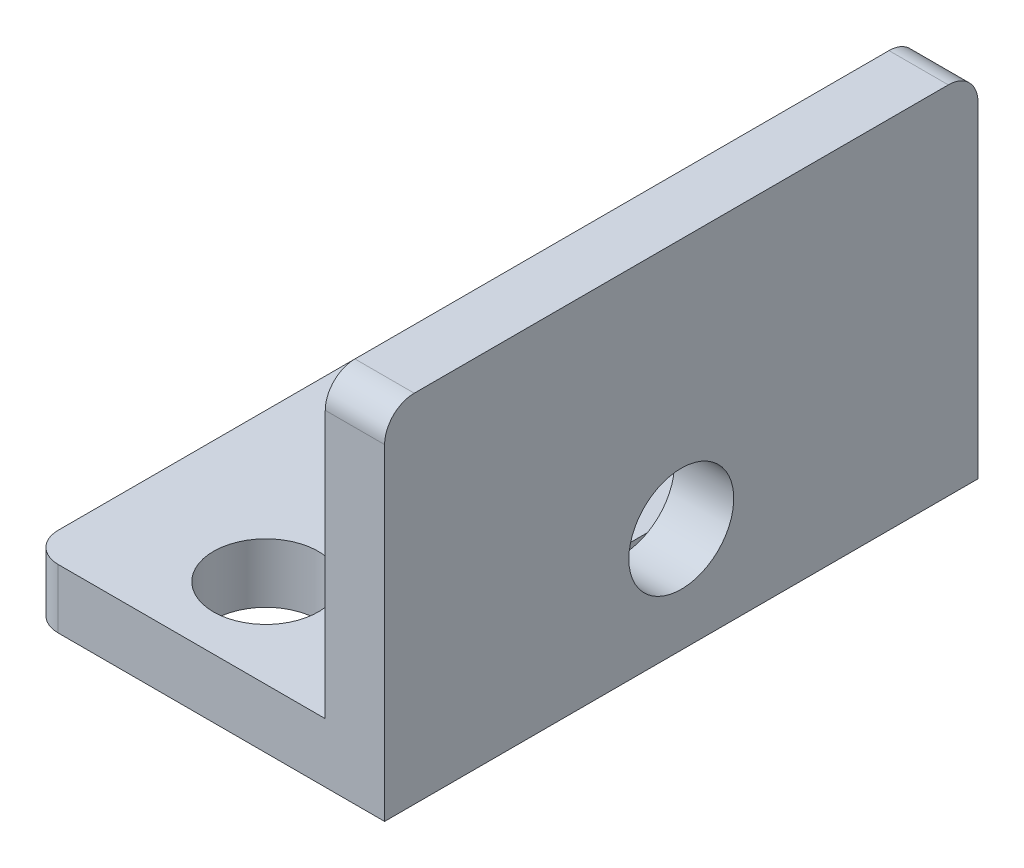
ISO-10303-21;
HEADER;
FILE_DESCRIPTION(('STEP AP214'),'2;1');
FILE_NAME('part.step','',(''),(''),'','','');
FILE_SCHEMA(('AUTOMOTIVE_DESIGN { 1 0 10303 214 1 1 1 1 }'));
ENDSEC;
DATA;
#1=APPLICATION_CONTEXT('core data for automotive mechanical design processes');
#2=APPLICATION_PROTOCOL_DEFINITION('international standard','automotive_design',2000,#1);
#3=PRODUCT_CONTEXT('',#1,'mechanical');
#4=PRODUCT('Part','Part','',(#3));
#5=PRODUCT_RELATED_PRODUCT_CATEGORY('part','',(#4));
#6=PRODUCT_DEFINITION_FORMATION('','',#4);
#7=PRODUCT_DEFINITION_CONTEXT('part definition',#1,'design');
#8=PRODUCT_DEFINITION('design','',#6,#7);
#9=PRODUCT_DEFINITION_SHAPE('','',#8);
#10=(LENGTH_UNIT() NAMED_UNIT(*) SI_UNIT(.MILLI.,.METRE.));
#11=(NAMED_UNIT(*) PLANE_ANGLE_UNIT() SI_UNIT($,.RADIAN.));
#12=(NAMED_UNIT(*) SI_UNIT($,.STERADIAN.) SOLID_ANGLE_UNIT());
#13=UNCERTAINTY_MEASURE_WITH_UNIT(LENGTH_MEASURE(1.E-05),#10,'distance_accuracy_value','');
#14=(GEOMETRIC_REPRESENTATION_CONTEXT(3) GLOBAL_UNCERTAINTY_ASSIGNED_CONTEXT((#13)) GLOBAL_UNIT_ASSIGNED_CONTEXT((#10,
#11,#12)) REPRESENTATION_CONTEXT('',''));
#15=CARTESIAN_POINT('',(0.,0.,0.));
#16=DIRECTION('',(0.,0.,1.));
#17=DIRECTION('',(1.,0.,0.));
#18=AXIS2_PLACEMENT_3D('',#15,#16,#17);
#19=CARTESIAN_POINT('',(-19.05,0.,31.75));
#20=DIRECTION('',(0.,1.,0.));
#21=DIRECTION('',(0.,0.,1.));
#22=AXIS2_PLACEMENT_3D('',#19,#20,#21);
#23=PLANE('',#22);
#24=CARTESIAN_POINT('',(-11.1125,0.,4.7625));
#25=DIRECTION('',(0.,1.,0.));
#26=DIRECTION('',(0.,0.,1.));
#27=AXIS2_PLACEMENT_3D('',#24,#25,#26);
#28=CIRCLE('',#27,2.80669999999999);
#29=CARTESIAN_POINT('',(-11.1125,0.,7.56919999999999));
#30=VERTEX_POINT('',#29);
#31=EDGE_CURVE('E233',#30,#30,#28,.T.);
#32=ORIENTED_EDGE('',*,*,#31,.T.);
#33=EDGE_LOOP('',(#32));
#34=FACE_BOUND('',#33,.T.);
#35=CARTESIAN_POINT('',(-11.1125,0.,26.9875));
#36=DIRECTION('',(0.,1.,0.));
#37=DIRECTION('',(0.,0.,1.));
#38=AXIS2_PLACEMENT_3D('',#35,#36,#37);
#39=CIRCLE('',#38,2.80669999999999);
#40=CARTESIAN_POINT('',(-11.1125,0.,29.7942));
#41=VERTEX_POINT('',#40);
#42=EDGE_CURVE('E226',#41,#41,#39,.T.);
#43=ORIENTED_EDGE('',*,*,#42,.T.);
#44=EDGE_LOOP('',(#43));
#45=FACE_BOUND('',#44,.T.);
#46=DIRECTION('',(0.,0.,-1.));
#47=VECTOR('',#46,1.);
#48=CARTESIAN_POINT('',(-19.05,0.,31.75));
#49=LINE('',#48,#47);
#50=CARTESIAN_POINT('',(-19.05,0.,30.1625));
#51=VERTEX_POINT('',#50);
#52=CARTESIAN_POINT('',(-19.05,0.,1.5875));
#53=VERTEX_POINT('',#52);
#54=EDGE_CURVE('E217',#51,#53,#49,.T.);
#55=ORIENTED_EDGE('',*,*,#54,.T.);
#56=CARTESIAN_POINT('',(-17.4625,0.,1.5875));
#57=DIRECTION('',(0.,1.,0.));
#58=DIRECTION('',(0.,0.,1.));
#59=AXIS2_PLACEMENT_3D('',#56,#57,#58);
#60=CIRCLE('',#59,1.5875);
#61=CARTESIAN_POINT('',(-17.4625,0.,0.));
#62=VERTEX_POINT('',#61);
#63=EDGE_CURVE('E162',#53,#62,#60,.F.);
#64=ORIENTED_EDGE('',*,*,#63,.T.);
#65=DIRECTION('',(1.,0.,0.));
#66=VECTOR('',#65,1.);
#67=CARTESIAN_POINT('',(-19.05,0.,0.));
#68=LINE('',#67,#66);
#69=CARTESIAN_POINT('',(0.,0.,0.));
#70=VERTEX_POINT('',#69);
#71=EDGE_CURVE('E214',#62,#70,#68,.T.);
#72=ORIENTED_EDGE('',*,*,#71,.T.);
#73=DIRECTION('',(0.,0.,-1.));
#74=VECTOR('',#73,1.);
#75=CARTESIAN_POINT('',(0.,0.,31.75));
#76=LINE('',#75,#74);
#77=CARTESIAN_POINT('',(0.,0.,31.75));
#78=VERTEX_POINT('',#77);
#79=EDGE_CURVE('E152',#78,#70,#76,.T.);
#80=ORIENTED_EDGE('',*,*,#79,.F.);
#81=DIRECTION('',(1.,0.,0.));
#82=VECTOR('',#81,1.);
#83=CARTESIAN_POINT('',(-19.05,0.,31.75));
#84=LINE('',#83,#82);
#85=CARTESIAN_POINT('',(-17.4625,0.,31.75));
#86=VERTEX_POINT('',#85);
#87=EDGE_CURVE('E198',#86,#78,#84,.T.);
#88=ORIENTED_EDGE('',*,*,#87,.F.);
#89=CARTESIAN_POINT('',(-17.4625,0.,30.1625));
#90=DIRECTION('',(0.,1.,0.));
#91=DIRECTION('',(0.,0.,1.));
#92=AXIS2_PLACEMENT_3D('',#89,#90,#91);
#93=CIRCLE('',#92,1.5875);
#94=EDGE_CURVE('E160',#86,#51,#93,.F.);
#95=ORIENTED_EDGE('',*,*,#94,.T.);
#96=EDGE_LOOP('',(#55,#64,#72,#80,#88,#95));
#97=FACE_BOUND('',#96,.T.);
#98=ADVANCED_FACE('F33',(#34,#45,#97),#23,.F.);
#99=CARTESIAN_POINT('',(0.,0.,31.75));
#100=DIRECTION('',(-1.,0.,0.));
#101=DIRECTION('',(0.,0.,1.));
#102=AXIS2_PLACEMENT_3D('',#99,#100,#101);
#103=PLANE('',#102);
#104=CARTESIAN_POINT('',(0.,5.6261,15.875));
#105=DIRECTION('',(-1.,0.,0.));
#106=DIRECTION('',(0.,0.,1.));
#107=AXIS2_PLACEMENT_3D('',#104,#105,#106);
#108=CIRCLE('',#107,2.80669999999999);
#109=CARTESIAN_POINT('',(0.,5.6261,18.6817));
#110=VERTEX_POINT('',#109);
#111=EDGE_CURVE('E130',#110,#110,#108,.T.);
#112=ORIENTED_EDGE('',*,*,#111,.T.);
#113=EDGE_LOOP('',(#112));
#114=FACE_BOUND('',#113,.T.);
#115=DIRECTION('',(0.,1.,0.));
#116=VECTOR('',#115,1.);
#117=CARTESIAN_POINT('',(0.,0.,0.));
#118=LINE('',#117,#116);
#119=CARTESIAN_POINT('',(0.,17.4625,0.));
#120=VERTEX_POINT('',#119);
#121=EDGE_CURVE('E211',#70,#120,#118,.T.);
#122=ORIENTED_EDGE('',*,*,#121,.T.);
#123=CARTESIAN_POINT('',(0.,17.4625,1.5875));
#124=DIRECTION('',(-1.,0.,0.));
#125=DIRECTION('',(0.,0.,1.));
#126=AXIS2_PLACEMENT_3D('',#123,#124,#125);
#127=CIRCLE('',#126,1.5875);
#128=CARTESIAN_POINT('',(0.,19.05,1.5875));
#129=VERTEX_POINT('',#128);
#130=EDGE_CURVE('E11',#120,#129,#127,.F.);
#131=ORIENTED_EDGE('',*,*,#130,.T.);
#132=DIRECTION('',(0.,0.,-1.));
#133=VECTOR('',#132,1.);
#134=CARTESIAN_POINT('',(0.,19.05,31.75));
#135=LINE('',#134,#133);
#136=CARTESIAN_POINT('',(0.,19.05,30.1625));
#137=VERTEX_POINT('',#136);
#138=EDGE_CURVE('E150',#137,#129,#135,.T.);
#139=ORIENTED_EDGE('',*,*,#138,.F.);
#140=CARTESIAN_POINT('',(0.,17.4625,30.1625));
#141=DIRECTION('',(-1.,0.,0.));
#142=DIRECTION('',(0.,0.,1.));
#143=AXIS2_PLACEMENT_3D('',#140,#141,#142);
#144=CIRCLE('',#143,1.5875);
#145=CARTESIAN_POINT('',(0.,17.4625,31.75));
#146=VERTEX_POINT('',#145);
#147=EDGE_CURVE('E41',#137,#146,#144,.F.);
#148=ORIENTED_EDGE('',*,*,#147,.T.);
#149=DIRECTION('',(0.,1.,0.));
#150=VECTOR('',#149,1.);
#151=CARTESIAN_POINT('',(0.,0.,31.75));
#152=LINE('',#151,#150);
#153=EDGE_CURVE('E189',#78,#146,#152,.T.);
#154=ORIENTED_EDGE('',*,*,#153,.F.);
#155=ORIENTED_EDGE('',*,*,#79,.T.);
#156=EDGE_LOOP('',(#122,#131,#139,#148,#154,#155));
#157=FACE_BOUND('',#156,.T.);
#158=ADVANCED_FACE('F188',(#114,#157),#103,.F.);
#159=CARTESIAN_POINT('',(0.,19.05,31.75));
#160=DIRECTION('',(0.,-1.,0.));
#161=DIRECTION('',(0.,0.,-1.));
#162=AXIS2_PLACEMENT_3D('',#159,#160,#161);
#163=PLANE('',#162);
#164=ORIENTED_EDGE('',*,*,#138,.T.);
#165=DIRECTION('',(-1.,0.,0.));
#166=VECTOR('',#165,1.);
#167=CARTESIAN_POINT('',(0.,19.05,1.5875));
#168=LINE('',#167,#166);
#169=CARTESIAN_POINT('',(-3.175,19.05,1.5875));
#170=VERTEX_POINT('',#169);
#171=EDGE_CURVE('E179',#129,#170,#168,.T.);
#172=ORIENTED_EDGE('',*,*,#171,.T.);
#173=DIRECTION('',(0.,0.,-1.));
#174=VECTOR('',#173,1.);
#175=CARTESIAN_POINT('',(-3.175,19.05,31.75));
#176=LINE('',#175,#174);
#177=CARTESIAN_POINT('',(-3.175,19.05,30.1625));
#178=VERTEX_POINT('',#177);
#179=EDGE_CURVE('E145',#178,#170,#176,.T.);
#180=ORIENTED_EDGE('',*,*,#179,.F.);
#181=DIRECTION('',(-1.,0.,0.));
#182=VECTOR('',#181,1.);
#183=CARTESIAN_POINT('',(0.,19.05,30.1625));
#184=LINE('',#183,#182);
#185=EDGE_CURVE('E53',#178,#137,#184,.F.);
#186=ORIENTED_EDGE('',*,*,#185,.T.);
#187=EDGE_LOOP('',(#164,#172,#180,#186));
#188=FACE_BOUND('',#187,.T.);
#189=ADVANCED_FACE('F201',(#188),#163,.F.);
#190=CARTESIAN_POINT('',(-3.175,19.05,31.75));
#191=DIRECTION('',(1.,0.,0.));
#192=DIRECTION('',(0.,1.,0.));
#193=AXIS2_PLACEMENT_3D('',#190,#191,#192);
#194=PLANE('',#193);
#195=ORIENTED_EDGE('',*,*,#179,.T.);
#196=CARTESIAN_POINT('',(-3.175,17.4625,1.5875));
#197=DIRECTION('',(1.,0.,0.));
#198=DIRECTION('',(0.,1.,0.));
#199=AXIS2_PLACEMENT_3D('',#196,#197,#198);
#200=CIRCLE('',#199,1.5875);
#201=CARTESIAN_POINT('',(-3.175,17.4625,0.));
#202=VERTEX_POINT('',#201);
#203=EDGE_CURVE('E184',#170,#202,#200,.F.);
#204=ORIENTED_EDGE('',*,*,#203,.T.);
#205=DIRECTION('',(0.,-1.,0.));
#206=VECTOR('',#205,1.);
#207=CARTESIAN_POINT('',(-3.175,19.05,0.));
#208=LINE('',#207,#206);
#209=CARTESIAN_POINT('',(-3.175,3.175,0.));
#210=VERTEX_POINT('',#209);
#211=EDGE_CURVE('E136',#202,#210,#208,.T.);
#212=ORIENTED_EDGE('',*,*,#211,.T.);
#213=DIRECTION('',(0.,0.,-1.));
#214=VECTOR('',#213,1.);
#215=CARTESIAN_POINT('',(-3.175,3.175,31.75));
#216=LINE('',#215,#214);
#217=CARTESIAN_POINT('',(-3.175,3.175,14.5076398864966));
#218=VERTEX_POINT('',#217);
#219=EDGE_CURVE('E132',#218,#210,#216,.T.);
#220=ORIENTED_EDGE('',*,*,#219,.F.);
#221=CARTESIAN_POINT('',(-3.175,5.6261,15.875));
#222=DIRECTION('',(-1.,0.,0.));
#223=DIRECTION('',(0.,0.,1.));
#224=AXIS2_PLACEMENT_3D('',#221,#222,#223);
#225=CIRCLE('',#224,2.80669999999999);
#226=CARTESIAN_POINT('',(-3.175,3.175,17.2423601135034));
#227=VERTEX_POINT('',#226);
#228=EDGE_CURVE('E115',#227,#218,#225,.T.);
#229=ORIENTED_EDGE('',*,*,#228,.F.);
#230=CARTESIAN_POINT('',(-3.175,3.175,31.75));
#231=VERTEX_POINT('',#230);
#232=EDGE_CURVE('E142',#231,#227,#216,.T.);
#233=ORIENTED_EDGE('',*,*,#232,.F.);
#234=DIRECTION('',(0.,-1.,0.));
#235=VECTOR('',#234,1.);
#236=CARTESIAN_POINT('',(-3.175,19.05,31.75));
#237=LINE('',#236,#235);
#238=CARTESIAN_POINT('',(-3.175,17.4625,31.75));
#239=VERTEX_POINT('',#238);
#240=EDGE_CURVE('E199',#239,#231,#237,.T.);
#241=ORIENTED_EDGE('',*,*,#240,.F.);
#242=CARTESIAN_POINT('',(-3.175,17.4625,30.1625));
#243=DIRECTION('',(1.,0.,0.));
#244=DIRECTION('',(0.,1.,0.));
#245=AXIS2_PLACEMENT_3D('',#242,#243,#244);
#246=CIRCLE('',#245,1.5875);
#247=EDGE_CURVE('E182',#239,#178,#246,.F.);
#248=ORIENTED_EDGE('',*,*,#247,.T.);
#249=EDGE_LOOP('',(#195,#204,#212,#220,#229,#233,#241,#248));
#250=FACE_BOUND('',#249,.T.);
#251=ADVANCED_FACE('F134',(#250),#194,.F.);
#252=CARTESIAN_POINT('',(-3.175,3.175,31.75));
#253=DIRECTION('',(0.,-1.,0.));
#254=DIRECTION('',(1.,0.,0.));
#255=AXIS2_PLACEMENT_3D('',#252,#253,#254);
#256=PLANE('',#255);
#257=CARTESIAN_POINT('',(-11.1125,3.175,4.7625));
#258=DIRECTION('',(0.,1.,0.));
#259=DIRECTION('',(0.,0.,1.));
#260=AXIS2_PLACEMENT_3D('',#257,#258,#259);
#261=CIRCLE('',#260,2.80669999999999);
#262=CARTESIAN_POINT('',(-11.1125,3.175,7.56919999999999));
#263=VERTEX_POINT('',#262);
#264=EDGE_CURVE('E239',#263,#263,#261,.T.);
#265=ORIENTED_EDGE('',*,*,#264,.F.);
#266=EDGE_LOOP('',(#265));
#267=FACE_BOUND('',#266,.T.);
#268=CARTESIAN_POINT('',(-11.1125,3.175,26.9875));
#269=DIRECTION('',(0.,1.,0.));
#270=DIRECTION('',(0.,0.,1.));
#271=AXIS2_PLACEMENT_3D('',#268,#269,#270);
#272=CIRCLE('',#271,2.80669999999999);
#273=CARTESIAN_POINT('',(-11.1125,3.175,29.7942));
#274=VERTEX_POINT('',#273);
#275=EDGE_CURVE('E228',#274,#274,#272,.T.);
#276=ORIENTED_EDGE('',*,*,#275,.F.);
#277=EDGE_LOOP('',(#276));
#278=FACE_BOUND('',#277,.T.);
#279=DIRECTION('',(-1.,0.,0.));
#280=VECTOR('',#279,1.);
#281=CARTESIAN_POINT('',(-3.175,3.175,0.));
#282=LINE('',#281,#280);
#283=CARTESIAN_POINT('',(-17.4625,3.175,0.));
#284=VERTEX_POINT('',#283);
#285=EDGE_CURVE('E210',#210,#284,#282,.T.);
#286=ORIENTED_EDGE('',*,*,#285,.T.);
#287=CARTESIAN_POINT('',(-17.4625,3.175,1.5875));
#288=DIRECTION('',(0.,-1.,0.));
#289=DIRECTION('',(1.,0.,0.));
#290=AXIS2_PLACEMENT_3D('',#287,#288,#289);
#291=CIRCLE('',#290,1.5875);
#292=CARTESIAN_POINT('',(-19.05,3.175,1.5875));
#293=VERTEX_POINT('',#292);
#294=EDGE_CURVE('E170',#284,#293,#291,.F.);
#295=ORIENTED_EDGE('',*,*,#294,.T.);
#296=DIRECTION('',(0.,0.,-1.));
#297=VECTOR('',#296,1.);
#298=CARTESIAN_POINT('',(-19.05,3.175,31.75));
#299=LINE('',#298,#297);
#300=CARTESIAN_POINT('',(-19.05,3.175,30.1625));
#301=VERTEX_POINT('',#300);
#302=EDGE_CURVE('E140',#301,#293,#299,.T.);
#303=ORIENTED_EDGE('',*,*,#302,.F.);
#304=CARTESIAN_POINT('',(-17.4625,3.175,30.1625));
#305=DIRECTION('',(0.,-1.,0.));
#306=DIRECTION('',(1.,0.,0.));
#307=AXIS2_PLACEMENT_3D('',#304,#305,#306);
#308=CIRCLE('',#307,1.5875);
#309=CARTESIAN_POINT('',(-17.4625,3.175,31.75));
#310=VERTEX_POINT('',#309);
#311=EDGE_CURVE('E168',#301,#310,#308,.F.);
#312=ORIENTED_EDGE('',*,*,#311,.T.);
#313=DIRECTION('',(-1.,0.,0.));
#314=VECTOR('',#313,1.);
#315=CARTESIAN_POINT('',(-3.175,3.175,31.75));
#316=LINE('',#315,#314);
#317=EDGE_CURVE('E219',#231,#310,#316,.T.);
#318=ORIENTED_EDGE('',*,*,#317,.F.);
#319=ORIENTED_EDGE('',*,*,#232,.T.);
#320=EDGE_CURVE('E129',#227,#218,#216,.T.);
#321=ORIENTED_EDGE('',*,*,#320,.T.);
#322=ORIENTED_EDGE('',*,*,#219,.T.);
#323=EDGE_LOOP('',(#286,#295,#303,#312,#318,#319,#321,#322));
#324=FACE_BOUND('',#323,.T.);
#325=ADVANCED_FACE('F143',(#267,#278,#324),#256,.F.);
#326=CARTESIAN_POINT('',(-19.05,3.175,31.75));
#327=DIRECTION('',(1.,0.,0.));
#328=DIRECTION('',(0.,0.,-1.));
#329=AXIS2_PLACEMENT_3D('',#326,#327,#328);
#330=PLANE('',#329);
#331=ORIENTED_EDGE('',*,*,#302,.T.);
#332=DIRECTION('',(0.,-1.,0.));
#333=VECTOR('',#332,1.);
#334=CARTESIAN_POINT('',(-19.05,3.175,1.5875));
#335=LINE('',#334,#333);
#336=EDGE_CURVE('E157',#293,#53,#335,.T.);
#337=ORIENTED_EDGE('',*,*,#336,.T.);
#338=ORIENTED_EDGE('',*,*,#54,.F.);
#339=DIRECTION('',(0.,-1.,0.));
#340=VECTOR('',#339,1.);
#341=CARTESIAN_POINT('',(-19.05,3.175,30.1625));
#342=LINE('',#341,#340);
#343=EDGE_CURVE('E155',#51,#301,#342,.F.);
#344=ORIENTED_EDGE('',*,*,#343,.T.);
#345=EDGE_LOOP('',(#331,#337,#338,#344));
#346=FACE_BOUND('',#345,.T.);
#347=ADVANCED_FACE('F311',(#346),#330,.F.);
#348=CARTESIAN_POINT('',(0.,0.,31.75));
#349=DIRECTION('',(0.,0.,1.));
#350=DIRECTION('',(1.,0.,0.));
#351=AXIS2_PLACEMENT_3D('',#348,#349,#350);
#352=PLANE('',#351);
#353=ORIENTED_EDGE('',*,*,#317,.T.);
#354=DIRECTION('',(0.,-1.,0.));
#355=VECTOR('',#354,1.);
#356=CARTESIAN_POINT('',(-17.4625,0.,31.75));
#357=LINE('',#356,#355);
#358=EDGE_CURVE('E175',#310,#86,#357,.T.);
#359=ORIENTED_EDGE('',*,*,#358,.T.);
#360=ORIENTED_EDGE('',*,*,#87,.T.);
#361=ORIENTED_EDGE('',*,*,#153,.T.);
#362=DIRECTION('',(-1.,0.,0.));
#363=VECTOR('',#362,1.);
#364=CARTESIAN_POINT('',(-3.175,17.4625,31.75));
#365=LINE('',#364,#363);
#366=EDGE_CURVE('E172',#146,#239,#365,.T.);
#367=ORIENTED_EDGE('',*,*,#366,.T.);
#368=ORIENTED_EDGE('',*,*,#240,.T.);
#369=EDGE_LOOP('',(#353,#359,#360,#361,#367,#368));
#370=FACE_BOUND('',#369,.T.);
#371=ADVANCED_FACE('F195',(#370),#352,.T.);
#372=CARTESIAN_POINT('',(0.,0.,0.));
#373=DIRECTION('',(0.,0.,1.));
#374=DIRECTION('',(1.,0.,0.));
#375=AXIS2_PLACEMENT_3D('',#372,#373,#374);
#376=PLANE('',#375);
#377=ORIENTED_EDGE('',*,*,#71,.F.);
#378=DIRECTION('',(0.,-1.,0.));
#379=VECTOR('',#378,1.);
#380=CARTESIAN_POINT('',(-17.4625,0.,0.));
#381=LINE('',#380,#379);
#382=EDGE_CURVE('E166',#62,#284,#381,.F.);
#383=ORIENTED_EDGE('',*,*,#382,.T.);
#384=ORIENTED_EDGE('',*,*,#285,.F.);
#385=ORIENTED_EDGE('',*,*,#211,.F.);
#386=DIRECTION('',(-1.,0.,0.));
#387=VECTOR('',#386,1.);
#388=CARTESIAN_POINT('',(0.,17.4625,0.));
#389=LINE('',#388,#387);
#390=EDGE_CURVE('E164',#202,#120,#389,.F.);
#391=ORIENTED_EDGE('',*,*,#390,.T.);
#392=ORIENTED_EDGE('',*,*,#121,.F.);
#393=EDGE_LOOP('',(#377,#383,#384,#385,#391,#392));
#394=FACE_BOUND('',#393,.T.);
#395=ADVANCED_FACE('F208',(#394),#376,.F.);
#396=CARTESIAN_POINT('',(-11.1125,3.175,26.9875));
#397=DIRECTION('',(0.,1.,0.));
#398=DIRECTION('',(0.,0.,1.));
#399=AXIS2_PLACEMENT_3D('',#396,#397,#398);
#400=CYLINDRICAL_SURFACE('',#399,2.80669999999999);
#401=ORIENTED_EDGE('',*,*,#275,.T.);
#402=EDGE_LOOP('',(#401));
#403=FACE_BOUND('',#402,.T.);
#404=ORIENTED_EDGE('',*,*,#42,.F.);
#405=EDGE_LOOP('',(#404));
#406=FACE_BOUND('',#405,.T.);
#407=ADVANCED_FACE('F300',(#403,#406),#400,.F.);
#408=CARTESIAN_POINT('',(-11.1125,3.175,4.7625));
#409=DIRECTION('',(0.,1.,0.));
#410=DIRECTION('',(0.,0.,1.));
#411=AXIS2_PLACEMENT_3D('',#408,#409,#410);
#412=CYLINDRICAL_SURFACE('',#411,2.80669999999999);
#413=ORIENTED_EDGE('',*,*,#264,.T.);
#414=EDGE_LOOP('',(#413));
#415=FACE_BOUND('',#414,.T.);
#416=ORIENTED_EDGE('',*,*,#31,.F.);
#417=EDGE_LOOP('',(#416));
#418=FACE_BOUND('',#417,.T.);
#419=ADVANCED_FACE('F255',(#415,#418),#412,.F.);
#420=CARTESIAN_POINT('',(-3.175,8.43279999999999,15.875));
#421=DIRECTION('',(-1.,0.,0.));
#422=DIRECTION('',(0.,0.,1.));
#423=AXIS2_PLACEMENT_3D('',#420,#421,#422);
#424=PLANE('',#423);
#425=EDGE_CURVE('E119',#218,#227,#225,.T.);
#426=ORIENTED_EDGE('',*,*,#425,.F.);
#427=ORIENTED_EDGE('',*,*,#320,.F.);
#428=EDGE_LOOP('',(#426,#427));
#429=FACE_BOUND('',#428,.T.);
#430=ADVANCED_FACE('F127',(#429),#424,.F.);
#431=CARTESIAN_POINT('',(-3.175,5.6261,15.875));
#432=DIRECTION('',(-1.,0.,0.));
#433=DIRECTION('',(0.,0.,1.));
#434=AXIS2_PLACEMENT_3D('',#431,#432,#433);
#435=CYLINDRICAL_SURFACE('',#434,2.80669999999999);
#436=ORIENTED_EDGE('',*,*,#425,.T.);
#437=ORIENTED_EDGE('',*,*,#228,.T.);
#438=EDGE_LOOP('',(#436,#437));
#439=FACE_BOUND('',#438,.T.);
#440=ORIENTED_EDGE('',*,*,#111,.F.);
#441=EDGE_LOOP('',(#440));
#442=FACE_BOUND('',#441,.T.);
#443=ADVANCED_FACE('F117',(#439,#442),#435,.F.);
#444=CARTESIAN_POINT('',(-17.4625,3.175,1.5875));
#445=DIRECTION('',(0.,-1.,0.));
#446=DIRECTION('',(0.,0.,-1.));
#447=AXIS2_PLACEMENT_3D('',#444,#445,#446);
#448=CYLINDRICAL_SURFACE('',#447,1.5875);
#449=ORIENTED_EDGE('',*,*,#294,.F.);
#450=ORIENTED_EDGE('',*,*,#382,.F.);
#451=ORIENTED_EDGE('',*,*,#63,.F.);
#452=ORIENTED_EDGE('',*,*,#336,.F.);
#453=EDGE_LOOP('',(#449,#450,#451,#452));
#454=FACE_BOUND('',#453,.T.);
#455=ADVANCED_FACE('F246',(#454),#448,.T.);
#456=CARTESIAN_POINT('',(-17.4625,0.,30.1625));
#457=DIRECTION('',(0.,1.,0.));
#458=DIRECTION('',(0.,0.,1.));
#459=AXIS2_PLACEMENT_3D('',#456,#457,#458);
#460=CYLINDRICAL_SURFACE('',#459,1.5875);
#461=ORIENTED_EDGE('',*,*,#311,.F.);
#462=ORIENTED_EDGE('',*,*,#343,.F.);
#463=ORIENTED_EDGE('',*,*,#94,.F.);
#464=ORIENTED_EDGE('',*,*,#358,.F.);
#465=EDGE_LOOP('',(#461,#462,#463,#464));
#466=FACE_BOUND('',#465,.T.);
#467=ADVANCED_FACE('F252',(#466),#460,.T.);
#468=CARTESIAN_POINT('',(0.,17.4625,1.5875));
#469=DIRECTION('',(-1.,0.,0.));
#470=DIRECTION('',(0.,0.,1.));
#471=AXIS2_PLACEMENT_3D('',#468,#469,#470);
#472=CYLINDRICAL_SURFACE('',#471,1.5875);
#473=ORIENTED_EDGE('',*,*,#130,.F.);
#474=ORIENTED_EDGE('',*,*,#390,.F.);
#475=ORIENTED_EDGE('',*,*,#203,.F.);
#476=ORIENTED_EDGE('',*,*,#171,.F.);
#477=EDGE_LOOP('',(#473,#474,#475,#476));
#478=FACE_BOUND('',#477,.T.);
#479=ADVANCED_FACE('F204',(#478),#472,.T.);
#480=CARTESIAN_POINT('',(0.,17.4625,30.1625));
#481=DIRECTION('',(1.,0.,0.));
#482=DIRECTION('',(0.,0.,-1.));
#483=AXIS2_PLACEMENT_3D('',#480,#481,#482);
#484=CYLINDRICAL_SURFACE('',#483,1.5875);
#485=ORIENTED_EDGE('',*,*,#147,.F.);
#486=ORIENTED_EDGE('',*,*,#185,.F.);
#487=ORIENTED_EDGE('',*,*,#247,.F.);
#488=ORIENTED_EDGE('',*,*,#366,.F.);
#489=EDGE_LOOP('',(#485,#486,#487,#488));
#490=FACE_BOUND('',#489,.T.);
#491=ADVANCED_FACE('F35',(#490),#484,.T.);
#492=CLOSED_SHELL('',(#98,#158,#189,#251,#325,#347,#371,#395,#407,#419,#430,#443,#455,#467,#479,#491));
#493=MANIFOLD_SOLID_BREP('B2',#492);
#494=ADVANCED_BREP_SHAPE_REPRESENTATION('',(#18,#493),#14);
#495=SHAPE_DEFINITION_REPRESENTATION(#9,#494);
ENDSEC;
END-ISO-10303-21;
